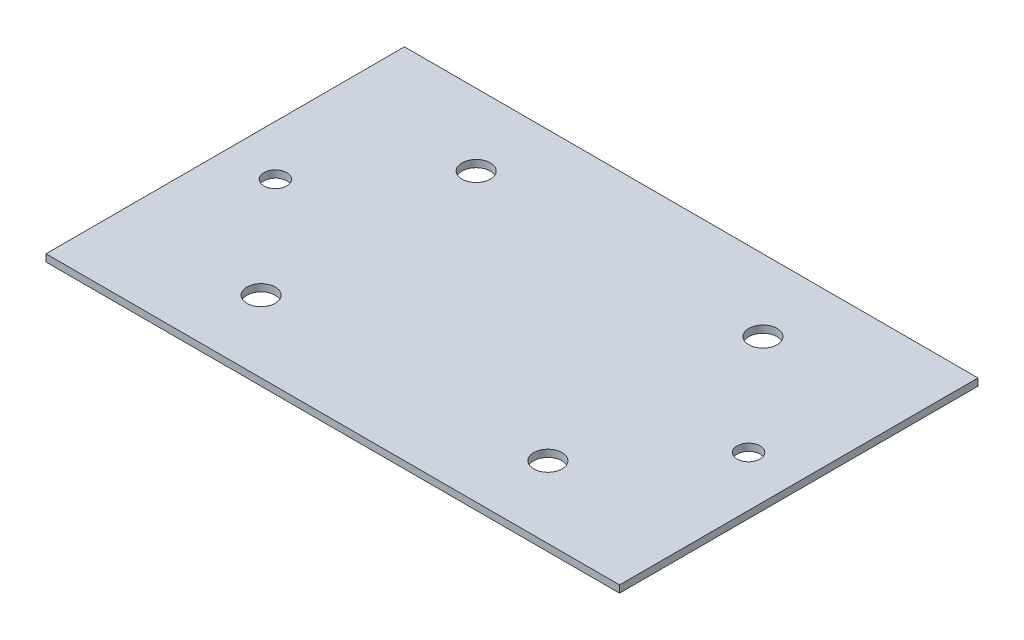
ISO-10303-21;
HEADER;
FILE_DESCRIPTION(('STEP AP214'),'2;1');
FILE_NAME('part.step','',(''),(''),'','','');
FILE_SCHEMA(('AUTOMOTIVE_DESIGN { 1 0 10303 214 1 1 1 1 }'));
ENDSEC;
DATA;
#1=APPLICATION_CONTEXT('core data for automotive mechanical design processes');
#2=APPLICATION_PROTOCOL_DEFINITION('international standard','automotive_design',2000,#1);
#3=PRODUCT_CONTEXT('',#1,'mechanical');
#4=PRODUCT('Part','Part','',(#3));
#5=PRODUCT_RELATED_PRODUCT_CATEGORY('part','',(#4));
#6=PRODUCT_DEFINITION_FORMATION('','',#4);
#7=PRODUCT_DEFINITION_CONTEXT('part definition',#1,'design');
#8=PRODUCT_DEFINITION('design','',#6,#7);
#9=PRODUCT_DEFINITION_SHAPE('','',#8);
#10=(LENGTH_UNIT() NAMED_UNIT(*) SI_UNIT(.MILLI.,.METRE.));
#11=(NAMED_UNIT(*) PLANE_ANGLE_UNIT() SI_UNIT($,.RADIAN.));
#12=(NAMED_UNIT(*) SI_UNIT($,.STERADIAN.) SOLID_ANGLE_UNIT());
#13=UNCERTAINTY_MEASURE_WITH_UNIT(LENGTH_MEASURE(1.E-05),#10,'distance_accuracy_value','');
#14=(GEOMETRIC_REPRESENTATION_CONTEXT(3) GLOBAL_UNCERTAINTY_ASSIGNED_CONTEXT((#13)) GLOBAL_UNIT_ASSIGNED_CONTEXT((#10,
#11,#12)) REPRESENTATION_CONTEXT('',''));
#15=CARTESIAN_POINT('',(0.,0.,0.));
#16=DIRECTION('',(0.,0.,1.));
#17=DIRECTION('',(1.,0.,0.));
#18=AXIS2_PLACEMENT_3D('',#15,#16,#17);
#19=CARTESIAN_POINT('',(0.,1.,0.));
#20=DIRECTION('',(0.,-1.,0.));
#21=DIRECTION('',(0.,0.,-1.));
#22=AXIS2_PLACEMENT_3D('',#19,#20,#21);
#23=PLANE('',#22);
#24=DIRECTION('',(0.,0.,1.));
#25=VECTOR('',#24,1.);
#26=CARTESIAN_POINT('',(0.,1.,0.));
#27=LINE('',#26,#25);
#28=CARTESIAN_POINT('',(0.,1.,-50.));
#29=VERTEX_POINT('',#28);
#30=CARTESIAN_POINT('',(0.,1.,0.));
#31=VERTEX_POINT('',#30);
#32=EDGE_CURVE('E96',#29,#31,#27,.T.);
#33=ORIENTED_EDGE('',*,*,#32,.T.);
#34=DIRECTION('',(1.,0.,0.));
#35=VECTOR('',#34,1.);
#36=CARTESIAN_POINT('',(0.,1.,0.));
#37=LINE('',#36,#35);
#38=CARTESIAN_POINT('',(80.,1.,0.));
#39=VERTEX_POINT('',#38);
#40=EDGE_CURVE('E91',#31,#39,#37,.T.);
#41=ORIENTED_EDGE('',*,*,#40,.T.);
#42=DIRECTION('',(0.,0.,-1.));
#43=VECTOR('',#42,1.);
#44=CARTESIAN_POINT('',(80.,1.,0.));
#45=LINE('',#44,#43);
#46=CARTESIAN_POINT('',(80.,1.,-50.));
#47=VERTEX_POINT('',#46);
#48=EDGE_CURVE('E94',#39,#47,#45,.T.);
#49=ORIENTED_EDGE('',*,*,#48,.T.);
#50=DIRECTION('',(-1.,0.,0.));
#51=VECTOR('',#50,1.);
#52=CARTESIAN_POINT('',(0.,1.,-50.));
#53=LINE('',#52,#51);
#54=EDGE_CURVE('E61',#47,#29,#53,.T.);
#55=ORIENTED_EDGE('',*,*,#54,.T.);
#56=EDGE_LOOP('',(#33,#41,#49,#55));
#57=FACE_BOUND('',#56,.T.);
#58=CARTESIAN_POINT('',(20.,1.,-40.));
#59=DIRECTION('',(0.,1.,0.));
#60=DIRECTION('',(0.,0.,1.));
#61=AXIS2_PLACEMENT_3D('',#58,#59,#60);
#62=CIRCLE('',#61,1.975);
#63=CARTESIAN_POINT('',(20.,1.,-38.025));
#64=VERTEX_POINT('',#63);
#65=EDGE_CURVE('E124',#64,#64,#62,.T.);
#66=ORIENTED_EDGE('',*,*,#65,.F.);
#67=EDGE_LOOP('',(#66));
#68=FACE_BOUND('',#67,.T.);
#69=CARTESIAN_POINT('',(60.,1.,-40.));
#70=DIRECTION('',(0.,1.,0.));
#71=DIRECTION('',(0.,0.,1.));
#72=AXIS2_PLACEMENT_3D('',#69,#70,#71);
#73=CIRCLE('',#72,1.975);
#74=CARTESIAN_POINT('',(60.,1.,-38.025));
#75=VERTEX_POINT('',#74);
#76=EDGE_CURVE('E135',#75,#75,#73,.T.);
#77=ORIENTED_EDGE('',*,*,#76,.F.);
#78=EDGE_LOOP('',(#77));
#79=FACE_BOUND('',#78,.T.);
#80=CARTESIAN_POINT('',(20.,1.,-10.));
#81=DIRECTION('',(0.,1.,0.));
#82=DIRECTION('',(0.,0.,1.));
#83=AXIS2_PLACEMENT_3D('',#80,#81,#82);
#84=CIRCLE('',#83,1.975);
#85=CARTESIAN_POINT('',(20.,1.,-8.025));
#86=VERTEX_POINT('',#85);
#87=EDGE_CURVE('E161',#86,#86,#84,.T.);
#88=ORIENTED_EDGE('',*,*,#87,.F.);
#89=EDGE_LOOP('',(#88));
#90=FACE_BOUND('',#89,.T.);
#91=CARTESIAN_POINT('',(60.,1.,-10.));
#92=DIRECTION('',(0.,1.,0.));
#93=DIRECTION('',(0.,0.,1.));
#94=AXIS2_PLACEMENT_3D('',#91,#92,#93);
#95=CIRCLE('',#94,1.975);
#96=CARTESIAN_POINT('',(60.,1.,-8.025));
#97=VERTEX_POINT('',#96);
#98=EDGE_CURVE('E168',#97,#97,#95,.T.);
#99=ORIENTED_EDGE('',*,*,#98,.F.);
#100=EDGE_LOOP('',(#99));
#101=FACE_BOUND('',#100,.T.);
#102=CARTESIAN_POINT('',(73.,1.,-25.));
#103=DIRECTION('',(0.,1.,0.));
#104=DIRECTION('',(0.,0.,1.));
#105=AXIS2_PLACEMENT_3D('',#102,#103,#104);
#106=CIRCLE('',#105,1.6);
#107=CARTESIAN_POINT('',(73.,1.,-23.4));
#108=VERTEX_POINT('',#107);
#109=EDGE_CURVE('E176',#108,#108,#106,.T.);
#110=ORIENTED_EDGE('',*,*,#109,.F.);
#111=EDGE_LOOP('',(#110));
#112=FACE_BOUND('',#111,.T.);
#113=CARTESIAN_POINT('',(7.,1.,-25.));
#114=DIRECTION('',(0.,1.,0.));
#115=DIRECTION('',(0.,0.,1.));
#116=AXIS2_PLACEMENT_3D('',#113,#114,#115);
#117=CIRCLE('',#116,1.6);
#118=CARTESIAN_POINT('',(7.,1.,-23.4));
#119=VERTEX_POINT('',#118);
#120=EDGE_CURVE('E184',#119,#119,#117,.T.);
#121=ORIENTED_EDGE('',*,*,#120,.F.);
#122=EDGE_LOOP('',(#121));
#123=FACE_BOUND('',#122,.T.);
#124=ADVANCED_FACE('F43',(#57,#68,#79,#90,#101,#112,#123),#23,.F.);
#125=CARTESIAN_POINT('',(0.,0.,0.));
#126=DIRECTION('',(0.,-1.,0.));
#127=DIRECTION('',(0.,0.,-1.));
#128=AXIS2_PLACEMENT_3D('',#125,#126,#127);
#129=PLANE('',#128);
#130=CARTESIAN_POINT('',(73.,0.,-25.));
#131=DIRECTION('',(0.,1.,0.));
#132=DIRECTION('',(0.,0.,1.));
#133=AXIS2_PLACEMENT_3D('',#130,#131,#132);
#134=CIRCLE('',#133,1.6);
#135=CARTESIAN_POINT('',(73.,0.,-23.4));
#136=VERTEX_POINT('',#135);
#137=EDGE_CURVE('E180',#136,#136,#134,.T.);
#138=ORIENTED_EDGE('',*,*,#137,.T.);
#139=EDGE_LOOP('',(#138));
#140=FACE_BOUND('',#139,.T.);
#141=CARTESIAN_POINT('',(20.,0.,-10.));
#142=DIRECTION('',(0.,1.,0.));
#143=DIRECTION('',(0.,0.,1.));
#144=AXIS2_PLACEMENT_3D('',#141,#142,#143);
#145=CIRCLE('',#144,1.975);
#146=CARTESIAN_POINT('',(20.,0.,-8.025));
#147=VERTEX_POINT('',#146);
#148=EDGE_CURVE('E164',#147,#147,#145,.T.);
#149=ORIENTED_EDGE('',*,*,#148,.T.);
#150=EDGE_LOOP('',(#149));
#151=FACE_BOUND('',#150,.T.);
#152=CARTESIAN_POINT('',(20.,0.,-40.));
#153=DIRECTION('',(0.,1.,0.));
#154=DIRECTION('',(0.,0.,1.));
#155=AXIS2_PLACEMENT_3D('',#152,#153,#154);
#156=CIRCLE('',#155,1.975);
#157=CARTESIAN_POINT('',(20.,0.,-38.025));
#158=VERTEX_POINT('',#157);
#159=EDGE_CURVE('E131',#158,#158,#156,.T.);
#160=ORIENTED_EDGE('',*,*,#159,.T.);
#161=EDGE_LOOP('',(#160));
#162=FACE_BOUND('',#161,.T.);
#163=DIRECTION('',(0.,0.,1.));
#164=VECTOR('',#163,1.);
#165=CARTESIAN_POINT('',(0.,0.,0.));
#166=LINE('',#165,#164);
#167=CARTESIAN_POINT('',(0.,0.,-50.));
#168=VERTEX_POINT('',#167);
#169=CARTESIAN_POINT('',(0.,0.,0.));
#170=VERTEX_POINT('',#169);
#171=EDGE_CURVE('E130',#168,#170,#166,.T.);
#172=ORIENTED_EDGE('',*,*,#171,.F.);
#173=DIRECTION('',(-1.,0.,0.));
#174=VECTOR('',#173,1.);
#175=CARTESIAN_POINT('',(0.,0.,-50.));
#176=LINE('',#175,#174);
#177=CARTESIAN_POINT('',(80.,0.,-50.));
#178=VERTEX_POINT('',#177);
#179=EDGE_CURVE('E84',#178,#168,#176,.T.);
#180=ORIENTED_EDGE('',*,*,#179,.F.);
#181=DIRECTION('',(0.,0.,-1.));
#182=VECTOR('',#181,1.);
#183=CARTESIAN_POINT('',(80.,0.,0.));
#184=LINE('',#183,#182);
#185=CARTESIAN_POINT('',(80.,0.,0.));
#186=VERTEX_POINT('',#185);
#187=EDGE_CURVE('E78',#186,#178,#184,.T.);
#188=ORIENTED_EDGE('',*,*,#187,.F.);
#189=DIRECTION('',(1.,0.,0.));
#190=VECTOR('',#189,1.);
#191=CARTESIAN_POINT('',(0.,0.,0.));
#192=LINE('',#191,#190);
#193=EDGE_CURVE('E101',#170,#186,#192,.T.);
#194=ORIENTED_EDGE('',*,*,#193,.F.);
#195=EDGE_LOOP('',(#172,#180,#188,#194));
#196=FACE_BOUND('',#195,.T.);
#197=CARTESIAN_POINT('',(60.,0.,-40.));
#198=DIRECTION('',(0.,1.,0.));
#199=DIRECTION('',(0.,0.,1.));
#200=AXIS2_PLACEMENT_3D('',#197,#198,#199);
#201=CIRCLE('',#200,1.975);
#202=CARTESIAN_POINT('',(60.,0.,-38.025));
#203=VERTEX_POINT('',#202);
#204=EDGE_CURVE('E132',#203,#203,#201,.T.);
#205=ORIENTED_EDGE('',*,*,#204,.T.);
#206=EDGE_LOOP('',(#205));
#207=FACE_BOUND('',#206,.T.);
#208=CARTESIAN_POINT('',(60.,0.,-10.));
#209=DIRECTION('',(0.,1.,0.));
#210=DIRECTION('',(0.,0.,1.));
#211=AXIS2_PLACEMENT_3D('',#208,#209,#210);
#212=CIRCLE('',#211,1.975);
#213=CARTESIAN_POINT('',(60.,0.,-8.025));
#214=VERTEX_POINT('',#213);
#215=EDGE_CURVE('E172',#214,#214,#212,.T.);
#216=ORIENTED_EDGE('',*,*,#215,.T.);
#217=EDGE_LOOP('',(#216));
#218=FACE_BOUND('',#217,.T.);
#219=CARTESIAN_POINT('',(7.,0.,-25.));
#220=DIRECTION('',(0.,1.,0.));
#221=DIRECTION('',(0.,0.,1.));
#222=AXIS2_PLACEMENT_3D('',#219,#220,#221);
#223=CIRCLE('',#222,1.6);
#224=CARTESIAN_POINT('',(7.,0.,-23.4));
#225=VERTEX_POINT('',#224);
#226=EDGE_CURVE('E188',#225,#225,#223,.T.);
#227=ORIENTED_EDGE('',*,*,#226,.T.);
#228=EDGE_LOOP('',(#227));
#229=FACE_BOUND('',#228,.T.);
#230=ADVANCED_FACE('F150',(#140,#151,#162,#196,#207,#218,#229),#129,.T.);
#231=CARTESIAN_POINT('',(0.,1.,0.));
#232=DIRECTION('',(1.,0.,0.));
#233=DIRECTION('',(0.,0.,-1.));
#234=AXIS2_PLACEMENT_3D('',#231,#232,#233);
#235=PLANE('',#234);
#236=ORIENTED_EDGE('',*,*,#171,.T.);
#237=DIRECTION('',(0.,-1.,0.));
#238=VECTOR('',#237,1.);
#239=CARTESIAN_POINT('',(0.,1.,0.));
#240=LINE('',#239,#238);
#241=EDGE_CURVE('E12',#31,#170,#240,.T.);
#242=ORIENTED_EDGE('',*,*,#241,.F.);
#243=ORIENTED_EDGE('',*,*,#32,.F.);
#244=DIRECTION('',(0.,-1.,0.));
#245=VECTOR('',#244,1.);
#246=CARTESIAN_POINT('',(0.,1.,-50.));
#247=LINE('',#246,#245);
#248=EDGE_CURVE('E108',#29,#168,#247,.T.);
#249=ORIENTED_EDGE('',*,*,#248,.T.);
#250=EDGE_LOOP('',(#236,#242,#243,#249));
#251=FACE_BOUND('',#250,.T.);
#252=ADVANCED_FACE('F45',(#251),#235,.F.);
#253=CARTESIAN_POINT('',(0.,1.,0.));
#254=DIRECTION('',(0.,0.,-1.));
#255=DIRECTION('',(-1.,0.,0.));
#256=AXIS2_PLACEMENT_3D('',#253,#254,#255);
#257=PLANE('',#256);
#258=ORIENTED_EDGE('',*,*,#193,.T.);
#259=DIRECTION('',(0.,-1.,0.));
#260=VECTOR('',#259,1.);
#261=CARTESIAN_POINT('',(80.,1.,0.));
#262=LINE('',#261,#260);
#263=EDGE_CURVE('E53',#39,#186,#262,.T.);
#264=ORIENTED_EDGE('',*,*,#263,.F.);
#265=ORIENTED_EDGE('',*,*,#40,.F.);
#266=ORIENTED_EDGE('',*,*,#241,.T.);
#267=EDGE_LOOP('',(#258,#264,#265,#266));
#268=FACE_BOUND('',#267,.T.);
#269=ADVANCED_FACE('F100',(#268),#257,.F.);
#270=CARTESIAN_POINT('',(80.,1.,0.));
#271=DIRECTION('',(-1.,0.,0.));
#272=DIRECTION('',(0.,0.,1.));
#273=AXIS2_PLACEMENT_3D('',#270,#271,#272);
#274=PLANE('',#273);
#275=ORIENTED_EDGE('',*,*,#187,.T.);
#276=DIRECTION('',(0.,-1.,0.));
#277=VECTOR('',#276,1.);
#278=CARTESIAN_POINT('',(80.,1.,-50.));
#279=LINE('',#278,#277);
#280=EDGE_CURVE('E103',#47,#178,#279,.T.);
#281=ORIENTED_EDGE('',*,*,#280,.F.);
#282=ORIENTED_EDGE('',*,*,#48,.F.);
#283=ORIENTED_EDGE('',*,*,#263,.T.);
#284=EDGE_LOOP('',(#275,#281,#282,#283));
#285=FACE_BOUND('',#284,.T.);
#286=ADVANCED_FACE('F104',(#285),#274,.F.);
#287=CARTESIAN_POINT('',(0.,1.,-50.));
#288=DIRECTION('',(0.,0.,1.));
#289=DIRECTION('',(1.,0.,0.));
#290=AXIS2_PLACEMENT_3D('',#287,#288,#289);
#291=PLANE('',#290);
#292=ORIENTED_EDGE('',*,*,#179,.T.);
#293=ORIENTED_EDGE('',*,*,#248,.F.);
#294=ORIENTED_EDGE('',*,*,#54,.F.);
#295=ORIENTED_EDGE('',*,*,#280,.T.);
#296=EDGE_LOOP('',(#292,#293,#294,#295));
#297=FACE_BOUND('',#296,.T.);
#298=ADVANCED_FACE('F147',(#297),#291,.F.);
#299=CARTESIAN_POINT('',(20.,1.,-40.));
#300=DIRECTION('',(0.,-1.,0.));
#301=DIRECTION('',(0.,0.,-1.));
#302=AXIS2_PLACEMENT_3D('',#299,#300,#301);
#303=CYLINDRICAL_SURFACE('',#302,1.975);
#304=ORIENTED_EDGE('',*,*,#65,.T.);
#305=EDGE_LOOP('',(#304));
#306=FACE_BOUND('',#305,.T.);
#307=ORIENTED_EDGE('',*,*,#159,.F.);
#308=EDGE_LOOP('',(#307));
#309=FACE_BOUND('',#308,.T.);
#310=ADVANCED_FACE('F219',(#306,#309),#303,.F.);
#311=CARTESIAN_POINT('',(60.,1.,-40.));
#312=DIRECTION('',(0.,-1.,0.));
#313=DIRECTION('',(0.,0.,-1.));
#314=AXIS2_PLACEMENT_3D('',#311,#312,#313);
#315=CYLINDRICAL_SURFACE('',#314,1.975);
#316=ORIENTED_EDGE('',*,*,#76,.T.);
#317=EDGE_LOOP('',(#316));
#318=FACE_BOUND('',#317,.T.);
#319=ORIENTED_EDGE('',*,*,#204,.F.);
#320=EDGE_LOOP('',(#319));
#321=FACE_BOUND('',#320,.T.);
#322=ADVANCED_FACE('F273',(#318,#321),#315,.F.);
#323=CARTESIAN_POINT('',(20.,1.,-10.));
#324=DIRECTION('',(0.,-1.,0.));
#325=DIRECTION('',(0.,0.,-1.));
#326=AXIS2_PLACEMENT_3D('',#323,#324,#325);
#327=CYLINDRICAL_SURFACE('',#326,1.975);
#328=ORIENTED_EDGE('',*,*,#87,.T.);
#329=EDGE_LOOP('',(#328));
#330=FACE_BOUND('',#329,.T.);
#331=ORIENTED_EDGE('',*,*,#148,.F.);
#332=EDGE_LOOP('',(#331));
#333=FACE_BOUND('',#332,.T.);
#334=ADVANCED_FACE('F282',(#330,#333),#327,.F.);
#335=CARTESIAN_POINT('',(60.,1.,-10.));
#336=DIRECTION('',(0.,-1.,0.));
#337=DIRECTION('',(0.,0.,-1.));
#338=AXIS2_PLACEMENT_3D('',#335,#336,#337);
#339=CYLINDRICAL_SURFACE('',#338,1.975);
#340=ORIENTED_EDGE('',*,*,#98,.T.);
#341=EDGE_LOOP('',(#340));
#342=FACE_BOUND('',#341,.T.);
#343=ORIENTED_EDGE('',*,*,#215,.F.);
#344=EDGE_LOOP('',(#343));
#345=FACE_BOUND('',#344,.T.);
#346=ADVANCED_FACE('F208',(#342,#345),#339,.F.);
#347=CARTESIAN_POINT('',(73.,1.,-25.));
#348=DIRECTION('',(0.,-1.,0.));
#349=DIRECTION('',(0.,0.,-1.));
#350=AXIS2_PLACEMENT_3D('',#347,#348,#349);
#351=CYLINDRICAL_SURFACE('',#350,1.6);
#352=ORIENTED_EDGE('',*,*,#109,.T.);
#353=EDGE_LOOP('',(#352));
#354=FACE_BOUND('',#353,.T.);
#355=ORIENTED_EDGE('',*,*,#137,.F.);
#356=EDGE_LOOP('',(#355));
#357=FACE_BOUND('',#356,.T.);
#358=ADVANCED_FACE('F202',(#354,#357),#351,.F.);
#359=CARTESIAN_POINT('',(7.,1.,-25.));
#360=DIRECTION('',(0.,-1.,0.));
#361=DIRECTION('',(0.,0.,-1.));
#362=AXIS2_PLACEMENT_3D('',#359,#360,#361);
#363=CYLINDRICAL_SURFACE('',#362,1.6);
#364=ORIENTED_EDGE('',*,*,#120,.T.);
#365=EDGE_LOOP('',(#364));
#366=FACE_BOUND('',#365,.T.);
#367=ORIENTED_EDGE('',*,*,#226,.F.);
#368=EDGE_LOOP('',(#367));
#369=FACE_BOUND('',#368,.T.);
#370=ADVANCED_FACE('F200',(#366,#369),#363,.F.);
#371=CLOSED_SHELL('',(#124,#230,#252,#269,#286,#298,#310,#322,#334,#346,#358,#370));
#372=MANIFOLD_SOLID_BREP('B2',#371);
#373=ADVANCED_BREP_SHAPE_REPRESENTATION('',(#18,#372),#14);
#374=SHAPE_DEFINITION_REPRESENTATION(#9,#373);
ENDSEC;
END-ISO-10303-21;
